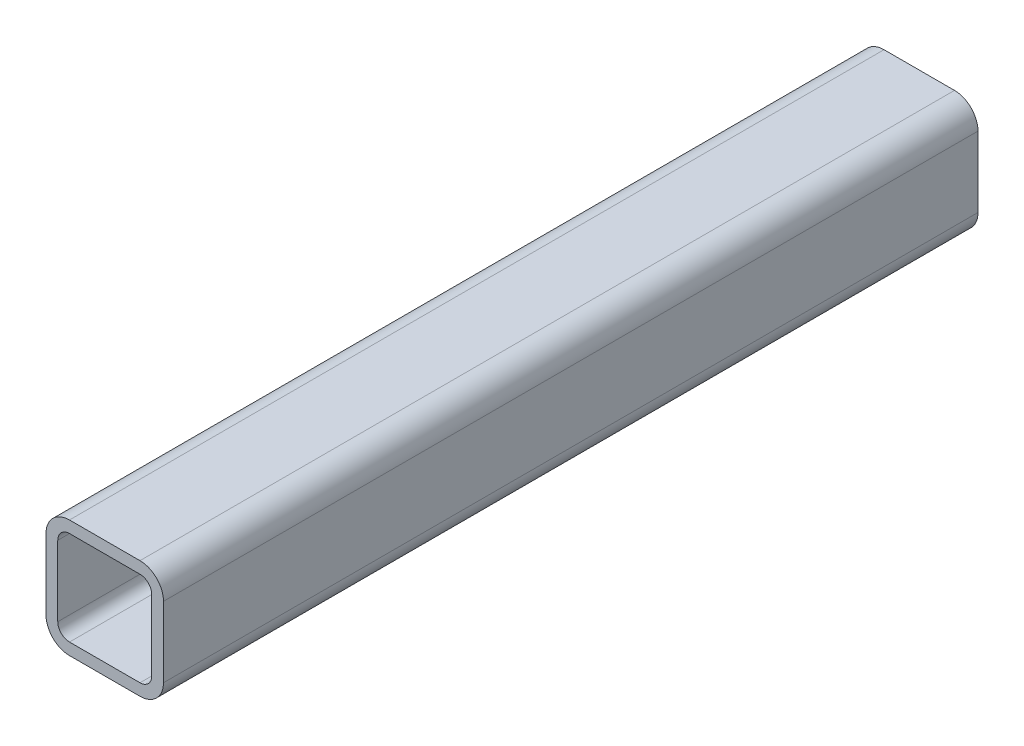
ISO-10303-21;
HEADER;
FILE_DESCRIPTION(('STEP AP214'),'2;1');
FILE_NAME('part.step','',(''),(''),'','','');
FILE_SCHEMA(('AUTOMOTIVE_DESIGN { 1 0 10303 214 1 1 1 1 }'));
ENDSEC;
DATA;
#1=APPLICATION_CONTEXT('core data for automotive mechanical design processes');
#2=APPLICATION_PROTOCOL_DEFINITION('international standard','automotive_design',2000,#1);
#3=PRODUCT_CONTEXT('',#1,'mechanical');
#4=PRODUCT('Part','Part','',(#3));
#5=PRODUCT_RELATED_PRODUCT_CATEGORY('part','',(#4));
#6=PRODUCT_DEFINITION_FORMATION('','',#4);
#7=PRODUCT_DEFINITION_CONTEXT('part definition',#1,'design');
#8=PRODUCT_DEFINITION('design','',#6,#7);
#9=PRODUCT_DEFINITION_SHAPE('','',#8);
#10=(LENGTH_UNIT() NAMED_UNIT(*) SI_UNIT(.MILLI.,.METRE.));
#11=(NAMED_UNIT(*) PLANE_ANGLE_UNIT() SI_UNIT($,.RADIAN.));
#12=(NAMED_UNIT(*) SI_UNIT($,.STERADIAN.) SOLID_ANGLE_UNIT());
#13=UNCERTAINTY_MEASURE_WITH_UNIT(LENGTH_MEASURE(1.E-05),#10,'distance_accuracy_value','');
#14=(GEOMETRIC_REPRESENTATION_CONTEXT(3) GLOBAL_UNCERTAINTY_ASSIGNED_CONTEXT((#13)) GLOBAL_UNIT_ASSIGNED_CONTEXT((#10,
#11,#12)) REPRESENTATION_CONTEXT('',''));
#15=CARTESIAN_POINT('',(0.,0.,0.));
#16=DIRECTION('',(0.,0.,1.));
#17=DIRECTION('',(1.,0.,0.));
#18=AXIS2_PLACEMENT_3D('',#15,#16,#17);
#19=CARTESIAN_POINT('',(-9.,9.,-104.));
#20=DIRECTION('',(0.,0.,1.));
#21=DIRECTION('',(1.,0.,0.));
#22=AXIS2_PLACEMENT_3D('',#19,#20,#21);
#23=PLANE('',#22);
#24=CARTESIAN_POINT('',(-9.,9.,-104.));
#25=DIRECTION('',(0.,0.,-1.));
#26=DIRECTION('',(1.,0.,0.));
#27=AXIS2_PLACEMENT_3D('',#24,#25,#26);
#28=CIRCLE('',#27,6.);
#29=CARTESIAN_POINT('',(-15.,8.99999999999996,-104.));
#30=VERTEX_POINT('',#29);
#31=CARTESIAN_POINT('',(-8.99999999999996,15.,-104.));
#32=VERTEX_POINT('',#31);
#33=EDGE_CURVE('E247',#30,#32,#28,.T.);
#34=ORIENTED_EDGE('',*,*,#33,.T.);
#35=DIRECTION('',(1.,0.,0.));
#36=VECTOR('',#35,1.);
#37=CARTESIAN_POINT('',(8.99999999999996,15.,-104.));
#38=LINE('',#37,#36);
#39=CARTESIAN_POINT('',(8.99999999999996,15.,-104.));
#40=VERTEX_POINT('',#39);
#41=EDGE_CURVE('E251',#32,#40,#38,.T.);
#42=ORIENTED_EDGE('',*,*,#41,.T.);
#43=CARTESIAN_POINT('',(9.,9.,-104.));
#44=DIRECTION('',(0.,0.,-1.));
#45=DIRECTION('',(1.,0.,0.));
#46=AXIS2_PLACEMENT_3D('',#43,#44,#45);
#47=CIRCLE('',#46,6.);
#48=CARTESIAN_POINT('',(15.,8.99999999999996,-104.));
#49=VERTEX_POINT('',#48);
#50=EDGE_CURVE('E255',#40,#49,#47,.T.);
#51=ORIENTED_EDGE('',*,*,#50,.T.);
#52=DIRECTION('',(0.,-1.,0.));
#53=VECTOR('',#52,1.);
#54=CARTESIAN_POINT('',(15.,-8.99999999999996,-104.));
#55=LINE('',#54,#53);
#56=CARTESIAN_POINT('',(15.,-8.99999999999996,-104.));
#57=VERTEX_POINT('',#56);
#58=EDGE_CURVE('E258',#49,#57,#55,.T.);
#59=ORIENTED_EDGE('',*,*,#58,.T.);
#60=CARTESIAN_POINT('',(9.,-9.,-104.));
#61=DIRECTION('',(0.,0.,-1.));
#62=DIRECTION('',(1.,0.,0.));
#63=AXIS2_PLACEMENT_3D('',#60,#61,#62);
#64=CIRCLE('',#63,6.);
#65=CARTESIAN_POINT('',(8.99999999999996,-15.,-104.));
#66=VERTEX_POINT('',#65);
#67=EDGE_CURVE('E261',#57,#66,#64,.T.);
#68=ORIENTED_EDGE('',*,*,#67,.T.);
#69=DIRECTION('',(-1.,0.,0.));
#70=VECTOR('',#69,1.);
#71=CARTESIAN_POINT('',(8.99999999999996,-15.,-104.));
#72=LINE('',#71,#70);
#73=CARTESIAN_POINT('',(-8.99999999999996,-15.,-104.));
#74=VERTEX_POINT('',#73);
#75=EDGE_CURVE('E264',#66,#74,#72,.T.);
#76=ORIENTED_EDGE('',*,*,#75,.T.);
#77=CARTESIAN_POINT('',(-9.,-9.,-104.));
#78=DIRECTION('',(0.,0.,-1.));
#79=DIRECTION('',(-1.,0.,0.));
#80=AXIS2_PLACEMENT_3D('',#77,#78,#79);
#81=CIRCLE('',#80,6.);
#82=CARTESIAN_POINT('',(-15.,-9.,-104.));
#83=VERTEX_POINT('',#82);
#84=EDGE_CURVE('E267',#74,#83,#81,.T.);
#85=ORIENTED_EDGE('',*,*,#84,.T.);
#86=DIRECTION('',(0.,1.,0.));
#87=VECTOR('',#86,1.);
#88=CARTESIAN_POINT('',(-15.,-8.99999999999996,-104.));
#89=LINE('',#88,#87);
#90=EDGE_CURVE('E270',#83,#30,#89,.T.);
#91=ORIENTED_EDGE('',*,*,#90,.T.);
#92=EDGE_LOOP('',(#34,#42,#51,#59,#68,#76,#85,#91));
#93=FACE_BOUND('',#92,.T.);
#94=CARTESIAN_POINT('',(9.,9.,-104.));
#95=DIRECTION('',(0.,0.,-1.));
#96=DIRECTION('',(1.,0.,0.));
#97=AXIS2_PLACEMENT_3D('',#94,#95,#96);
#98=CIRCLE('',#97,3.);
#99=CARTESIAN_POINT('',(8.99999999999996,12.,-104.));
#100=VERTEX_POINT('',#99);
#101=CARTESIAN_POINT('',(12.,8.99999999999996,-104.));
#102=VERTEX_POINT('',#101);
#103=EDGE_CURVE('E157',#100,#102,#98,.T.);
#104=ORIENTED_EDGE('',*,*,#103,.F.);
#105=DIRECTION('',(1.,0.,0.));
#106=VECTOR('',#105,1.);
#107=CARTESIAN_POINT('',(8.99999999999996,12.,-104.));
#108=LINE('',#107,#106);
#109=CARTESIAN_POINT('',(-8.99999999999996,12.,-104.));
#110=VERTEX_POINT('',#109);
#111=EDGE_CURVE('E199',#110,#100,#108,.T.);
#112=ORIENTED_EDGE('',*,*,#111,.F.);
#113=CARTESIAN_POINT('',(-9.,9.,-104.));
#114=DIRECTION('',(0.,0.,-1.));
#115=DIRECTION('',(1.,0.,0.));
#116=AXIS2_PLACEMENT_3D('',#113,#114,#115);
#117=CIRCLE('',#116,3.);
#118=CARTESIAN_POINT('',(-12.,8.99999999999998,-104.));
#119=VERTEX_POINT('',#118);
#120=EDGE_CURVE('E196',#119,#110,#117,.T.);
#121=ORIENTED_EDGE('',*,*,#120,.F.);
#122=DIRECTION('',(0.,1.,0.));
#123=VECTOR('',#122,1.);
#124=CARTESIAN_POINT('',(-12.,-8.99999999999996,-104.));
#125=LINE('',#124,#123);
#126=CARTESIAN_POINT('',(-12.,-8.99999999999996,-104.));
#127=VERTEX_POINT('',#126);
#128=EDGE_CURVE('E193',#127,#119,#125,.T.);
#129=ORIENTED_EDGE('',*,*,#128,.F.);
#130=CARTESIAN_POINT('',(-9.,-9.,-104.));
#131=DIRECTION('',(0.,0.,-1.));
#132=DIRECTION('',(-1.,0.,0.));
#133=AXIS2_PLACEMENT_3D('',#130,#131,#132);
#134=CIRCLE('',#133,3.);
#135=CARTESIAN_POINT('',(-8.99999999999998,-12.,-104.));
#136=VERTEX_POINT('',#135);
#137=EDGE_CURVE('E190',#136,#127,#134,.T.);
#138=ORIENTED_EDGE('',*,*,#137,.F.);
#139=DIRECTION('',(-1.,0.,0.));
#140=VECTOR('',#139,1.);
#141=CARTESIAN_POINT('',(8.99999999999996,-12.,-104.));
#142=LINE('',#141,#140);
#143=CARTESIAN_POINT('',(8.99999999999996,-12.,-104.));
#144=VERTEX_POINT('',#143);
#145=EDGE_CURVE('E185',#144,#136,#142,.T.);
#146=ORIENTED_EDGE('',*,*,#145,.F.);
#147=CARTESIAN_POINT('',(9.,-9.,-104.));
#148=DIRECTION('',(0.,0.,-1.));
#149=DIRECTION('',(1.,0.,0.));
#150=AXIS2_PLACEMENT_3D('',#147,#148,#149);
#151=CIRCLE('',#150,3.);
#152=CARTESIAN_POINT('',(12.,-9.,-104.));
#153=VERTEX_POINT('',#152);
#154=EDGE_CURVE('E180',#153,#144,#151,.T.);
#155=ORIENTED_EDGE('',*,*,#154,.F.);
#156=DIRECTION('',(0.,-1.,0.));
#157=VECTOR('',#156,1.);
#158=CARTESIAN_POINT('',(12.,-8.99999999999998,-104.));
#159=LINE('',#158,#157);
#160=EDGE_CURVE('E166',#102,#153,#159,.T.);
#161=ORIENTED_EDGE('',*,*,#160,.F.);
#162=EDGE_LOOP('',(#104,#112,#121,#129,#138,#146,#155,#161));
#163=FACE_BOUND('',#162,.T.);
#164=ADVANCED_FACE('F43',(#93,#163),#23,.F.);
#165=CARTESIAN_POINT('',(-9.,9.,104.));
#166=DIRECTION('',(0.,0.,1.));
#167=DIRECTION('',(1.,0.,0.));
#168=AXIS2_PLACEMENT_3D('',#165,#166,#167);
#169=PLANE('',#168);
#170=CARTESIAN_POINT('',(-9.,9.,104.));
#171=DIRECTION('',(0.,0.,-1.));
#172=DIRECTION('',(1.,0.,0.));
#173=AXIS2_PLACEMENT_3D('',#170,#171,#172);
#174=CIRCLE('',#173,6.);
#175=CARTESIAN_POINT('',(-15.,8.99999999999996,104.));
#176=VERTEX_POINT('',#175);
#177=CARTESIAN_POINT('',(-8.99999999999996,15.,104.));
#178=VERTEX_POINT('',#177);
#179=EDGE_CURVE('E175',#176,#178,#174,.T.);
#180=ORIENTED_EDGE('',*,*,#179,.F.);
#181=DIRECTION('',(0.,1.,0.));
#182=VECTOR('',#181,1.);
#183=CARTESIAN_POINT('',(-15.,-8.99999999999996,104.));
#184=LINE('',#183,#182);
#185=CARTESIAN_POINT('',(-15.,-9.,104.));
#186=VERTEX_POINT('',#185);
#187=EDGE_CURVE('E252',#186,#176,#184,.T.);
#188=ORIENTED_EDGE('',*,*,#187,.F.);
#189=CARTESIAN_POINT('',(-9.,-9.,104.));
#190=DIRECTION('',(0.,0.,-1.));
#191=DIRECTION('',(-1.,0.,0.));
#192=AXIS2_PLACEMENT_3D('',#189,#190,#191);
#193=CIRCLE('',#192,6.);
#194=CARTESIAN_POINT('',(-8.99999999999996,-15.,104.));
#195=VERTEX_POINT('',#194);
#196=EDGE_CURVE('E292',#195,#186,#193,.T.);
#197=ORIENTED_EDGE('',*,*,#196,.F.);
#198=DIRECTION('',(-1.,0.,0.));
#199=VECTOR('',#198,1.);
#200=CARTESIAN_POINT('',(8.99999999999996,-15.,104.));
#201=LINE('',#200,#199);
#202=CARTESIAN_POINT('',(8.99999999999996,-15.,104.));
#203=VERTEX_POINT('',#202);
#204=EDGE_CURVE('E289',#203,#195,#201,.T.);
#205=ORIENTED_EDGE('',*,*,#204,.F.);
#206=CARTESIAN_POINT('',(9.,-9.,104.));
#207=DIRECTION('',(0.,0.,-1.));
#208=DIRECTION('',(1.,0.,0.));
#209=AXIS2_PLACEMENT_3D('',#206,#207,#208);
#210=CIRCLE('',#209,6.);
#211=CARTESIAN_POINT('',(15.,-8.99999999999996,104.));
#212=VERTEX_POINT('',#211);
#213=EDGE_CURVE('E286',#212,#203,#210,.T.);
#214=ORIENTED_EDGE('',*,*,#213,.F.);
#215=DIRECTION('',(0.,-1.,0.));
#216=VECTOR('',#215,1.);
#217=CARTESIAN_POINT('',(15.,-8.99999999999996,104.));
#218=LINE('',#217,#216);
#219=CARTESIAN_POINT('',(15.,8.99999999999996,104.));
#220=VERTEX_POINT('',#219);
#221=EDGE_CURVE('E283',#220,#212,#218,.T.);
#222=ORIENTED_EDGE('',*,*,#221,.F.);
#223=CARTESIAN_POINT('',(9.,9.,104.));
#224=DIRECTION('',(0.,0.,-1.));
#225=DIRECTION('',(1.,0.,0.));
#226=AXIS2_PLACEMENT_3D('',#223,#224,#225);
#227=CIRCLE('',#226,6.);
#228=CARTESIAN_POINT('',(8.99999999999996,15.,104.));
#229=VERTEX_POINT('',#228);
#230=EDGE_CURVE('E280',#229,#220,#227,.T.);
#231=ORIENTED_EDGE('',*,*,#230,.F.);
#232=DIRECTION('',(1.,0.,0.));
#233=VECTOR('',#232,1.);
#234=CARTESIAN_POINT('',(8.99999999999996,15.,104.));
#235=LINE('',#234,#233);
#236=EDGE_CURVE('E277',#178,#229,#235,.T.);
#237=ORIENTED_EDGE('',*,*,#236,.F.);
#238=EDGE_LOOP('',(#180,#188,#197,#205,#214,#222,#231,#237));
#239=FACE_BOUND('',#238,.T.);
#240=DIRECTION('',(1.,0.,0.));
#241=VECTOR('',#240,1.);
#242=CARTESIAN_POINT('',(8.99999999999996,12.,104.));
#243=LINE('',#242,#241);
#244=CARTESIAN_POINT('',(-8.99999999999996,12.,104.));
#245=VERTEX_POINT('',#244);
#246=CARTESIAN_POINT('',(8.99999999999996,12.,104.));
#247=VERTEX_POINT('',#246);
#248=EDGE_CURVE('E167',#245,#247,#243,.T.);
#249=ORIENTED_EDGE('',*,*,#248,.T.);
#250=CARTESIAN_POINT('',(9.,9.,104.));
#251=DIRECTION('',(0.,0.,-1.));
#252=DIRECTION('',(1.,0.,0.));
#253=AXIS2_PLACEMENT_3D('',#250,#251,#252);
#254=CIRCLE('',#253,3.);
#255=CARTESIAN_POINT('',(12.,8.99999999999996,104.));
#256=VERTEX_POINT('',#255);
#257=EDGE_CURVE('E67',#247,#256,#254,.T.);
#258=ORIENTED_EDGE('',*,*,#257,.T.);
#259=DIRECTION('',(0.,-1.,0.));
#260=VECTOR('',#259,1.);
#261=CARTESIAN_POINT('',(12.,-8.99999999999998,104.));
#262=LINE('',#261,#260);
#263=CARTESIAN_POINT('',(12.,-9.,104.));
#264=VERTEX_POINT('',#263);
#265=EDGE_CURVE('E173',#256,#264,#262,.T.);
#266=ORIENTED_EDGE('',*,*,#265,.T.);
#267=CARTESIAN_POINT('',(9.,-9.,104.));
#268=DIRECTION('',(0.,0.,-1.));
#269=DIRECTION('',(1.,0.,0.));
#270=AXIS2_PLACEMENT_3D('',#267,#268,#269);
#271=CIRCLE('',#270,3.);
#272=CARTESIAN_POINT('',(8.99999999999996,-12.,104.));
#273=VERTEX_POINT('',#272);
#274=EDGE_CURVE('E206',#264,#273,#271,.T.);
#275=ORIENTED_EDGE('',*,*,#274,.T.);
#276=DIRECTION('',(-1.,0.,0.));
#277=VECTOR('',#276,1.);
#278=CARTESIAN_POINT('',(8.99999999999996,-12.,104.));
#279=LINE('',#278,#277);
#280=CARTESIAN_POINT('',(-8.99999999999998,-12.,104.));
#281=VERTEX_POINT('',#280);
#282=EDGE_CURVE('E210',#273,#281,#279,.T.);
#283=ORIENTED_EDGE('',*,*,#282,.T.);
#284=CARTESIAN_POINT('',(-9.,-9.,104.));
#285=DIRECTION('',(0.,0.,-1.));
#286=DIRECTION('',(-1.,0.,0.));
#287=AXIS2_PLACEMENT_3D('',#284,#285,#286);
#288=CIRCLE('',#287,3.);
#289=CARTESIAN_POINT('',(-12.,-8.99999999999996,104.));
#290=VERTEX_POINT('',#289);
#291=EDGE_CURVE('E214',#281,#290,#288,.T.);
#292=ORIENTED_EDGE('',*,*,#291,.T.);
#293=DIRECTION('',(0.,1.,0.));
#294=VECTOR('',#293,1.);
#295=CARTESIAN_POINT('',(-12.,-8.99999999999996,104.));
#296=LINE('',#295,#294);
#297=CARTESIAN_POINT('',(-12.,8.99999999999998,104.));
#298=VERTEX_POINT('',#297);
#299=EDGE_CURVE('E218',#290,#298,#296,.T.);
#300=ORIENTED_EDGE('',*,*,#299,.T.);
#301=CARTESIAN_POINT('',(-9.,9.,104.));
#302=DIRECTION('',(0.,0.,-1.));
#303=DIRECTION('',(1.,0.,0.));
#304=AXIS2_PLACEMENT_3D('',#301,#302,#303);
#305=CIRCLE('',#304,3.);
#306=EDGE_CURVE('E222',#298,#245,#305,.T.);
#307=ORIENTED_EDGE('',*,*,#306,.T.);
#308=EDGE_LOOP('',(#249,#258,#266,#275,#283,#292,#300,#307));
#309=FACE_BOUND('',#308,.T.);
#310=ADVANCED_FACE('F332',(#239,#309),#169,.T.);
#311=CARTESIAN_POINT('',(-9.,9.,-104.));
#312=DIRECTION('',(0.,0.,1.));
#313=DIRECTION('',(1.,0.,0.));
#314=AXIS2_PLACEMENT_3D('',#311,#312,#313);
#315=CYLINDRICAL_SURFACE('',#314,6.);
#316=ORIENTED_EDGE('',*,*,#179,.T.);
#317=DIRECTION('',(0.,0.,1.));
#318=VECTOR('',#317,1.);
#319=CARTESIAN_POINT('',(-8.99999999999996,15.,-104.));
#320=LINE('',#319,#318);
#321=EDGE_CURVE('E11',#32,#178,#320,.T.);
#322=ORIENTED_EDGE('',*,*,#321,.F.);
#323=ORIENTED_EDGE('',*,*,#33,.F.);
#324=DIRECTION('',(0.,0.,1.));
#325=VECTOR('',#324,1.);
#326=CARTESIAN_POINT('',(-15.,8.99999999999996,-104.));
#327=LINE('',#326,#325);
#328=EDGE_CURVE('E273',#30,#176,#327,.T.);
#329=ORIENTED_EDGE('',*,*,#328,.T.);
#330=EDGE_LOOP('',(#316,#322,#323,#329));
#331=FACE_BOUND('',#330,.T.);
#332=ADVANCED_FACE('F45',(#331),#315,.T.);
#333=CARTESIAN_POINT('',(8.99999999999996,15.,-104.));
#334=DIRECTION('',(0.,-1.,0.));
#335=DIRECTION('',(0.,0.,-1.));
#336=AXIS2_PLACEMENT_3D('',#333,#334,#335);
#337=PLANE('',#336);
#338=ORIENTED_EDGE('',*,*,#236,.T.);
#339=DIRECTION('',(0.,0.,1.));
#340=VECTOR('',#339,1.);
#341=CARTESIAN_POINT('',(8.99999999999996,15.,-104.));
#342=LINE('',#341,#340);
#343=EDGE_CURVE('E52',#40,#229,#342,.T.);
#344=ORIENTED_EDGE('',*,*,#343,.F.);
#345=ORIENTED_EDGE('',*,*,#41,.F.);
#346=ORIENTED_EDGE('',*,*,#321,.T.);
#347=EDGE_LOOP('',(#338,#344,#345,#346));
#348=FACE_BOUND('',#347,.T.);
#349=ADVANCED_FACE('F349',(#348),#337,.F.);
#350=CARTESIAN_POINT('',(9.,9.,-104.));
#351=DIRECTION('',(0.,0.,1.));
#352=DIRECTION('',(1.,0.,0.));
#353=AXIS2_PLACEMENT_3D('',#350,#351,#352);
#354=CYLINDRICAL_SURFACE('',#353,6.);
#355=ORIENTED_EDGE('',*,*,#230,.T.);
#356=DIRECTION('',(0.,0.,1.));
#357=VECTOR('',#356,1.);
#358=CARTESIAN_POINT('',(15.,8.99999999999996,-104.));
#359=LINE('',#358,#357);
#360=EDGE_CURVE('E316',#49,#220,#359,.T.);
#361=ORIENTED_EDGE('',*,*,#360,.F.);
#362=ORIENTED_EDGE('',*,*,#50,.F.);
#363=ORIENTED_EDGE('',*,*,#343,.T.);
#364=EDGE_LOOP('',(#355,#361,#362,#363));
#365=FACE_BOUND('',#364,.T.);
#366=ADVANCED_FACE('F326',(#365),#354,.T.);
#367=CARTESIAN_POINT('',(15.,-8.99999999999996,-104.));
#368=DIRECTION('',(-1.,0.,0.));
#369=DIRECTION('',(0.,0.,1.));
#370=AXIS2_PLACEMENT_3D('',#367,#368,#369);
#371=PLANE('',#370);
#372=ORIENTED_EDGE('',*,*,#221,.T.);
#373=DIRECTION('',(0.,0.,1.));
#374=VECTOR('',#373,1.);
#375=CARTESIAN_POINT('',(15.,-8.99999999999996,-104.));
#376=LINE('',#375,#374);
#377=EDGE_CURVE('E312',#57,#212,#376,.T.);
#378=ORIENTED_EDGE('',*,*,#377,.F.);
#379=ORIENTED_EDGE('',*,*,#58,.F.);
#380=ORIENTED_EDGE('',*,*,#360,.T.);
#381=EDGE_LOOP('',(#372,#378,#379,#380));
#382=FACE_BOUND('',#381,.T.);
#383=ADVANCED_FACE('F338',(#382),#371,.F.);
#384=CARTESIAN_POINT('',(9.,-9.,-104.));
#385=DIRECTION('',(0.,0.,1.));
#386=DIRECTION('',(1.,0.,0.));
#387=AXIS2_PLACEMENT_3D('',#384,#385,#386);
#388=CYLINDRICAL_SURFACE('',#387,6.);
#389=ORIENTED_EDGE('',*,*,#213,.T.);
#390=DIRECTION('',(0.,0.,1.));
#391=VECTOR('',#390,1.);
#392=CARTESIAN_POINT('',(8.99999999999996,-15.,-104.));
#393=LINE('',#392,#391);
#394=EDGE_CURVE('E308',#66,#203,#393,.T.);
#395=ORIENTED_EDGE('',*,*,#394,.F.);
#396=ORIENTED_EDGE('',*,*,#67,.F.);
#397=ORIENTED_EDGE('',*,*,#377,.T.);
#398=EDGE_LOOP('',(#389,#395,#396,#397));
#399=FACE_BOUND('',#398,.T.);
#400=ADVANCED_FACE('F342',(#399),#388,.T.);
#401=CARTESIAN_POINT('',(8.99999999999996,-15.,-104.));
#402=DIRECTION('',(0.,1.,0.));
#403=DIRECTION('',(0.,0.,1.));
#404=AXIS2_PLACEMENT_3D('',#401,#402,#403);
#405=PLANE('',#404);
#406=ORIENTED_EDGE('',*,*,#204,.T.);
#407=DIRECTION('',(0.,0.,1.));
#408=VECTOR('',#407,1.);
#409=CARTESIAN_POINT('',(-8.99999999999996,-15.,-104.));
#410=LINE('',#409,#408);
#411=EDGE_CURVE('E304',#74,#195,#410,.T.);
#412=ORIENTED_EDGE('',*,*,#411,.F.);
#413=ORIENTED_EDGE('',*,*,#75,.F.);
#414=ORIENTED_EDGE('',*,*,#394,.T.);
#415=EDGE_LOOP('',(#406,#412,#413,#414));
#416=FACE_BOUND('',#415,.T.);
#417=ADVANCED_FACE('F362',(#416),#405,.F.);
#418=CARTESIAN_POINT('',(-9.,-9.,-104.));
#419=DIRECTION('',(0.,0.,1.));
#420=DIRECTION('',(1.,0.,0.));
#421=AXIS2_PLACEMENT_3D('',#418,#419,#420);
#422=CYLINDRICAL_SURFACE('',#421,6.);
#423=ORIENTED_EDGE('',*,*,#196,.T.);
#424=DIRECTION('',(0.,0.,1.));
#425=VECTOR('',#424,1.);
#426=CARTESIAN_POINT('',(-15.,-9.,-104.));
#427=LINE('',#426,#425);
#428=EDGE_CURVE('E300',#83,#186,#427,.T.);
#429=ORIENTED_EDGE('',*,*,#428,.F.);
#430=ORIENTED_EDGE('',*,*,#84,.F.);
#431=ORIENTED_EDGE('',*,*,#411,.T.);
#432=EDGE_LOOP('',(#423,#429,#430,#431));
#433=FACE_BOUND('',#432,.T.);
#434=ADVANCED_FACE('F360',(#433),#422,.T.);
#435=CARTESIAN_POINT('',(-15.,-8.99999999999996,-104.));
#436=DIRECTION('',(1.,0.,0.));
#437=DIRECTION('',(0.,0.,-1.));
#438=AXIS2_PLACEMENT_3D('',#435,#436,#437);
#439=PLANE('',#438);
#440=ORIENTED_EDGE('',*,*,#187,.T.);
#441=ORIENTED_EDGE('',*,*,#328,.F.);
#442=ORIENTED_EDGE('',*,*,#90,.F.);
#443=ORIENTED_EDGE('',*,*,#428,.T.);
#444=EDGE_LOOP('',(#440,#441,#442,#443));
#445=FACE_BOUND('',#444,.T.);
#446=ADVANCED_FACE('F355',(#445),#439,.F.);
#447=CARTESIAN_POINT('',(9.,9.,-104.));
#448=DIRECTION('',(0.,0.,1.));
#449=DIRECTION('',(1.,0.,0.));
#450=AXIS2_PLACEMENT_3D('',#447,#448,#449);
#451=CYLINDRICAL_SURFACE('',#450,3.);
#452=ORIENTED_EDGE('',*,*,#257,.F.);
#453=DIRECTION('',(0.,0.,1.));
#454=VECTOR('',#453,1.);
#455=CARTESIAN_POINT('',(8.99999999999996,12.,-104.));
#456=LINE('',#455,#454);
#457=EDGE_CURVE('E161',#100,#247,#456,.T.);
#458=ORIENTED_EDGE('',*,*,#457,.F.);
#459=ORIENTED_EDGE('',*,*,#103,.T.);
#460=DIRECTION('',(0.,0.,1.));
#461=VECTOR('',#460,1.);
#462=CARTESIAN_POINT('',(12.,8.99999999999996,-104.));
#463=LINE('',#462,#461);
#464=EDGE_CURVE('E160',#102,#256,#463,.T.);
#465=ORIENTED_EDGE('',*,*,#464,.T.);
#466=EDGE_LOOP('',(#452,#458,#459,#465));
#467=FACE_BOUND('',#466,.T.);
#468=ADVANCED_FACE('F159',(#467),#451,.F.);
#469=CARTESIAN_POINT('',(12.,-8.99999999999998,-104.));
#470=DIRECTION('',(-1.,0.,0.));
#471=DIRECTION('',(0.,0.,1.));
#472=AXIS2_PLACEMENT_3D('',#469,#470,#471);
#473=PLANE('',#472);
#474=ORIENTED_EDGE('',*,*,#265,.F.);
#475=ORIENTED_EDGE('',*,*,#464,.F.);
#476=ORIENTED_EDGE('',*,*,#160,.T.);
#477=DIRECTION('',(0.,0.,1.));
#478=VECTOR('',#477,1.);
#479=CARTESIAN_POINT('',(12.,-9.,-104.));
#480=LINE('',#479,#478);
#481=EDGE_CURVE('E176',#153,#264,#480,.T.);
#482=ORIENTED_EDGE('',*,*,#481,.T.);
#483=EDGE_LOOP('',(#474,#475,#476,#482));
#484=FACE_BOUND('',#483,.T.);
#485=ADVANCED_FACE('F170',(#484),#473,.T.);
#486=CARTESIAN_POINT('',(9.,-9.,-104.));
#487=DIRECTION('',(0.,0.,1.));
#488=DIRECTION('',(1.,0.,0.));
#489=AXIS2_PLACEMENT_3D('',#486,#487,#488);
#490=CYLINDRICAL_SURFACE('',#489,3.);
#491=ORIENTED_EDGE('',*,*,#274,.F.);
#492=ORIENTED_EDGE('',*,*,#481,.F.);
#493=ORIENTED_EDGE('',*,*,#154,.T.);
#494=DIRECTION('',(0.,0.,1.));
#495=VECTOR('',#494,1.);
#496=CARTESIAN_POINT('',(8.99999999999996,-12.,-104.));
#497=LINE('',#496,#495);
#498=EDGE_CURVE('E242',#144,#273,#497,.T.);
#499=ORIENTED_EDGE('',*,*,#498,.T.);
#500=EDGE_LOOP('',(#491,#492,#493,#499));
#501=FACE_BOUND('',#500,.T.);
#502=ADVANCED_FACE('F387',(#501),#490,.F.);
#503=CARTESIAN_POINT('',(8.99999999999996,-12.,-104.));
#504=DIRECTION('',(0.,1.,0.));
#505=DIRECTION('',(0.,0.,1.));
#506=AXIS2_PLACEMENT_3D('',#503,#504,#505);
#507=PLANE('',#506);
#508=ORIENTED_EDGE('',*,*,#282,.F.);
#509=ORIENTED_EDGE('',*,*,#498,.F.);
#510=ORIENTED_EDGE('',*,*,#145,.T.);
#511=DIRECTION('',(0.,0.,1.));
#512=VECTOR('',#511,1.);
#513=CARTESIAN_POINT('',(-8.99999999999998,-12.,-104.));
#514=LINE('',#513,#512);
#515=EDGE_CURVE('E239',#136,#281,#514,.T.);
#516=ORIENTED_EDGE('',*,*,#515,.T.);
#517=EDGE_LOOP('',(#508,#509,#510,#516));
#518=FACE_BOUND('',#517,.T.);
#519=ADVANCED_FACE('F391',(#518),#507,.T.);
#520=CARTESIAN_POINT('',(-9.,-9.,-104.));
#521=DIRECTION('',(0.,0.,1.));
#522=DIRECTION('',(1.,0.,0.));
#523=AXIS2_PLACEMENT_3D('',#520,#521,#522);
#524=CYLINDRICAL_SURFACE('',#523,3.);
#525=ORIENTED_EDGE('',*,*,#291,.F.);
#526=ORIENTED_EDGE('',*,*,#515,.F.);
#527=ORIENTED_EDGE('',*,*,#137,.T.);
#528=DIRECTION('',(0.,0.,1.));
#529=VECTOR('',#528,1.);
#530=CARTESIAN_POINT('',(-12.,-8.99999999999996,-104.));
#531=LINE('',#530,#529);
#532=EDGE_CURVE('E236',#127,#290,#531,.T.);
#533=ORIENTED_EDGE('',*,*,#532,.T.);
#534=EDGE_LOOP('',(#525,#526,#527,#533));
#535=FACE_BOUND('',#534,.T.);
#536=ADVANCED_FACE('F397',(#535),#524,.F.);
#537=CARTESIAN_POINT('',(-12.,-8.99999999999996,-104.));
#538=DIRECTION('',(1.,0.,0.));
#539=DIRECTION('',(0.,0.,-1.));
#540=AXIS2_PLACEMENT_3D('',#537,#538,#539);
#541=PLANE('',#540);
#542=ORIENTED_EDGE('',*,*,#299,.F.);
#543=ORIENTED_EDGE('',*,*,#532,.F.);
#544=ORIENTED_EDGE('',*,*,#128,.T.);
#545=DIRECTION('',(0.,0.,1.));
#546=VECTOR('',#545,1.);
#547=CARTESIAN_POINT('',(-12.,8.99999999999998,-104.));
#548=LINE('',#547,#546);
#549=EDGE_CURVE('E233',#119,#298,#548,.T.);
#550=ORIENTED_EDGE('',*,*,#549,.T.);
#551=EDGE_LOOP('',(#542,#543,#544,#550));
#552=FACE_BOUND('',#551,.T.);
#553=ADVANCED_FACE('F401',(#552),#541,.T.);
#554=CARTESIAN_POINT('',(-9.,9.,-104.));
#555=DIRECTION('',(0.,0.,1.));
#556=DIRECTION('',(1.,0.,0.));
#557=AXIS2_PLACEMENT_3D('',#554,#555,#556);
#558=CYLINDRICAL_SURFACE('',#557,3.);
#559=ORIENTED_EDGE('',*,*,#306,.F.);
#560=ORIENTED_EDGE('',*,*,#549,.F.);
#561=ORIENTED_EDGE('',*,*,#120,.T.);
#562=DIRECTION('',(0.,0.,1.));
#563=VECTOR('',#562,1.);
#564=CARTESIAN_POINT('',(-8.99999999999996,12.,-104.));
#565=LINE('',#564,#563);
#566=EDGE_CURVE('E59',#110,#245,#565,.T.);
#567=ORIENTED_EDGE('',*,*,#566,.T.);
#568=EDGE_LOOP('',(#559,#560,#561,#567));
#569=FACE_BOUND('',#568,.T.);
#570=ADVANCED_FACE('F405',(#569),#558,.F.);
#571=CARTESIAN_POINT('',(8.99999999999996,12.,-104.));
#572=DIRECTION('',(0.,-1.,0.));
#573=DIRECTION('',(0.,0.,-1.));
#574=AXIS2_PLACEMENT_3D('',#571,#572,#573);
#575=PLANE('',#574);
#576=ORIENTED_EDGE('',*,*,#248,.F.);
#577=ORIENTED_EDGE('',*,*,#566,.F.);
#578=ORIENTED_EDGE('',*,*,#111,.T.);
#579=ORIENTED_EDGE('',*,*,#457,.T.);
#580=EDGE_LOOP('',(#576,#577,#578,#579));
#581=FACE_BOUND('',#580,.T.);
#582=ADVANCED_FACE('F409',(#581),#575,.T.);
#583=CLOSED_SHELL('',(#164,#310,#332,#349,#366,#383,#400,#417,#434,#446,#468,#485,#502,#519,
#536,#553,#570,#582));
#584=MANIFOLD_SOLID_BREP('B2',#583);
#585=ADVANCED_BREP_SHAPE_REPRESENTATION('',(#18,#584),#14);
#586=SHAPE_DEFINITION_REPRESENTATION(#9,#585);
ENDSEC;
END-ISO-10303-21;
